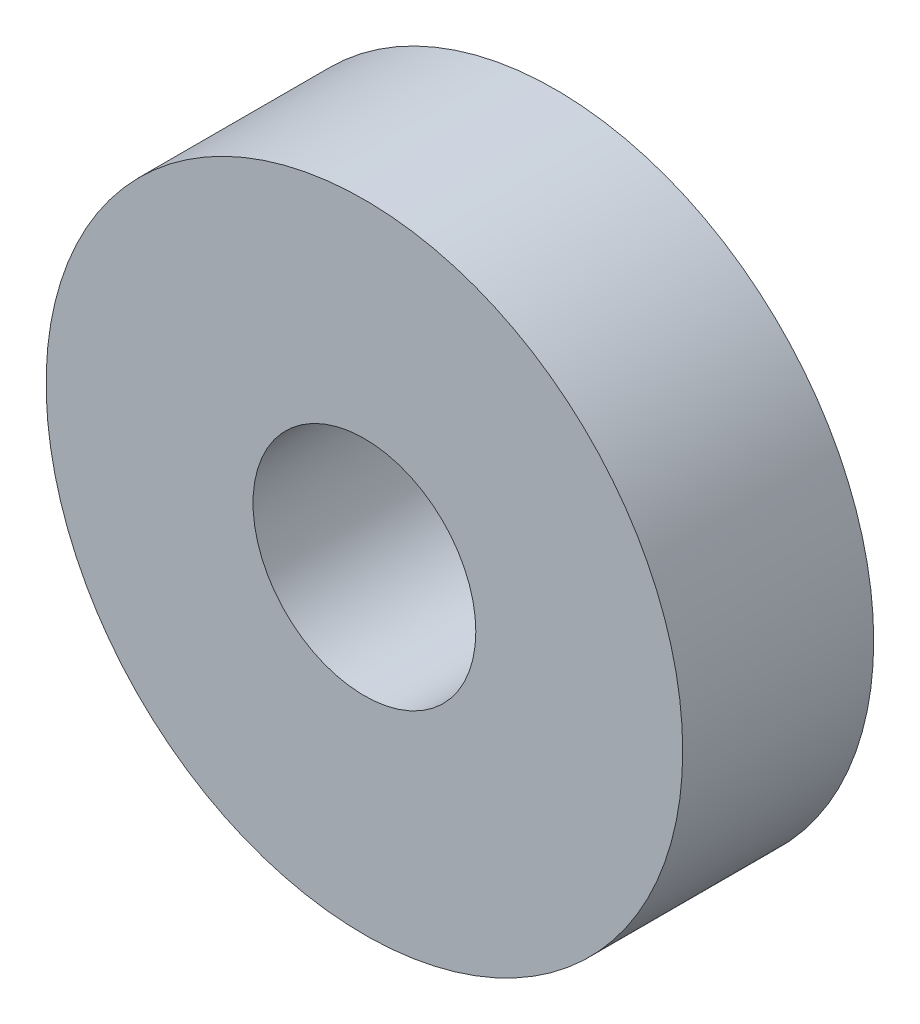
ISO-10303-21;
HEADER;
FILE_DESCRIPTION(('STEP AP214'),'2;1');
FILE_NAME('part.step','',(''),(''),'','','');
FILE_SCHEMA(('AUTOMOTIVE_DESIGN { 1 0 10303 214 1 1 1 1 }'));
ENDSEC;
DATA;
#1=APPLICATION_CONTEXT('core data for automotive mechanical design processes');
#2=APPLICATION_PROTOCOL_DEFINITION('international standard','automotive_design',2000,#1);
#3=PRODUCT_CONTEXT('',#1,'mechanical');
#4=PRODUCT('Part','Part','',(#3));
#5=PRODUCT_RELATED_PRODUCT_CATEGORY('part','',(#4));
#6=PRODUCT_DEFINITION_FORMATION('','',#4);
#7=PRODUCT_DEFINITION_CONTEXT('part definition',#1,'design');
#8=PRODUCT_DEFINITION('design','',#6,#7);
#9=PRODUCT_DEFINITION_SHAPE('','',#8);
#10=(LENGTH_UNIT() NAMED_UNIT(*) SI_UNIT(.MILLI.,.METRE.));
#11=(NAMED_UNIT(*) PLANE_ANGLE_UNIT() SI_UNIT($,.RADIAN.));
#12=(NAMED_UNIT(*) SI_UNIT($,.STERADIAN.) SOLID_ANGLE_UNIT());
#13=UNCERTAINTY_MEASURE_WITH_UNIT(LENGTH_MEASURE(1.E-05),#10,'distance_accuracy_value','');
#14=(GEOMETRIC_REPRESENTATION_CONTEXT(3) GLOBAL_UNCERTAINTY_ASSIGNED_CONTEXT((#13)) GLOBAL_UNIT_ASSIGNED_CONTEXT((#10,
#11,#12)) REPRESENTATION_CONTEXT('',''));
#15=CARTESIAN_POINT('',(0.,0.,0.));
#16=DIRECTION('',(0.,0.,1.));
#17=DIRECTION('',(1.,0.,0.));
#18=AXIS2_PLACEMENT_3D('',#15,#16,#17);
#19=CARTESIAN_POINT('',(0.,0.,3.));
#20=DIRECTION('',(0.,0.,1.));
#21=DIRECTION('',(1.,0.,0.));
#22=AXIS2_PLACEMENT_3D('',#19,#20,#21);
#23=PLANE('',#22);
#24=CARTESIAN_POINT('',(0.,0.,3.));
#25=DIRECTION('',(0.,0.,1.));
#26=DIRECTION('',(1.,0.,0.));
#27=AXIS2_PLACEMENT_3D('',#24,#25,#26);
#28=CIRCLE('',#27,5.);
#29=CARTESIAN_POINT('',(5.,0.,3.));
#30=VERTEX_POINT('',#29);
#31=EDGE_CURVE('E10',#30,#30,#28,.T.);
#32=ORIENTED_EDGE('',*,*,#31,.T.);
#33=EDGE_LOOP('',(#32));
#34=FACE_BOUND('',#33,.T.);
#35=CARTESIAN_POINT('',(0.,0.,3.));
#36=DIRECTION('',(0.,0.,1.));
#37=DIRECTION('',(1.,0.,0.));
#38=AXIS2_PLACEMENT_3D('',#35,#36,#37);
#39=CIRCLE('',#38,1.75);
#40=CARTESIAN_POINT('',(1.75,0.,3.));
#41=VERTEX_POINT('',#40);
#42=EDGE_CURVE('E42',#41,#41,#39,.T.);
#43=ORIENTED_EDGE('',*,*,#42,.F.);
#44=EDGE_LOOP('',(#43));
#45=FACE_BOUND('',#44,.T.);
#46=ADVANCED_FACE('F31',(#34,#45),#23,.T.);
#47=CARTESIAN_POINT('',(0.,0.,0.));
#48=DIRECTION('',(0.,0.,1.));
#49=DIRECTION('',(1.,0.,0.));
#50=AXIS2_PLACEMENT_3D('',#47,#48,#49);
#51=PLANE('',#50);
#52=CARTESIAN_POINT('',(0.,0.,0.));
#53=DIRECTION('',(0.,0.,1.));
#54=DIRECTION('',(1.,0.,0.));
#55=AXIS2_PLACEMENT_3D('',#52,#53,#54);
#56=CIRCLE('',#55,5.);
#57=CARTESIAN_POINT('',(5.,0.,0.));
#58=VERTEX_POINT('',#57);
#59=EDGE_CURVE('E35',#58,#58,#56,.T.);
#60=ORIENTED_EDGE('',*,*,#59,.F.);
#61=EDGE_LOOP('',(#60));
#62=FACE_BOUND('',#61,.T.);
#63=CARTESIAN_POINT('',(0.,0.,0.));
#64=DIRECTION('',(0.,0.,1.));
#65=DIRECTION('',(1.,0.,0.));
#66=AXIS2_PLACEMENT_3D('',#63,#64,#65);
#67=CIRCLE('',#66,1.75);
#68=CARTESIAN_POINT('',(1.75,0.,0.));
#69=VERTEX_POINT('',#68);
#70=EDGE_CURVE('E44',#69,#69,#67,.T.);
#71=ORIENTED_EDGE('',*,*,#70,.T.);
#72=EDGE_LOOP('',(#71));
#73=FACE_BOUND('',#72,.T.);
#74=ADVANCED_FACE('F54',(#62,#73),#51,.F.);
#75=CARTESIAN_POINT('',(0.,0.,3.));
#76=DIRECTION('',(0.,0.,-1.));
#77=DIRECTION('',(-1.,0.,0.));
#78=AXIS2_PLACEMENT_3D('',#75,#76,#77);
#79=CYLINDRICAL_SURFACE('',#78,5.);
#80=ORIENTED_EDGE('',*,*,#31,.F.);
#81=EDGE_LOOP('',(#80));
#82=FACE_BOUND('',#81,.T.);
#83=ORIENTED_EDGE('',*,*,#59,.T.);
#84=EDGE_LOOP('',(#83));
#85=FACE_BOUND('',#84,.T.);
#86=ADVANCED_FACE('F33',(#82,#85),#79,.T.);
#87=CARTESIAN_POINT('',(0.,0.,3.));
#88=DIRECTION('',(0.,0.,-1.));
#89=DIRECTION('',(-1.,0.,0.));
#90=AXIS2_PLACEMENT_3D('',#87,#88,#89);
#91=CYLINDRICAL_SURFACE('',#90,1.75);
#92=ORIENTED_EDGE('',*,*,#42,.T.);
#93=EDGE_LOOP('',(#92));
#94=FACE_BOUND('',#93,.T.);
#95=ORIENTED_EDGE('',*,*,#70,.F.);
#96=EDGE_LOOP('',(#95));
#97=FACE_BOUND('',#96,.T.);
#98=ADVANCED_FACE('F50',(#94,#97),#91,.F.);
#99=CLOSED_SHELL('',(#46,#74,#86,#98));
#100=MANIFOLD_SOLID_BREP('B2',#99);
#101=ADVANCED_BREP_SHAPE_REPRESENTATION('',(#18,#100),#14);
#102=SHAPE_DEFINITION_REPRESENTATION(#9,#101);
ENDSEC;
END-ISO-10303-21;
